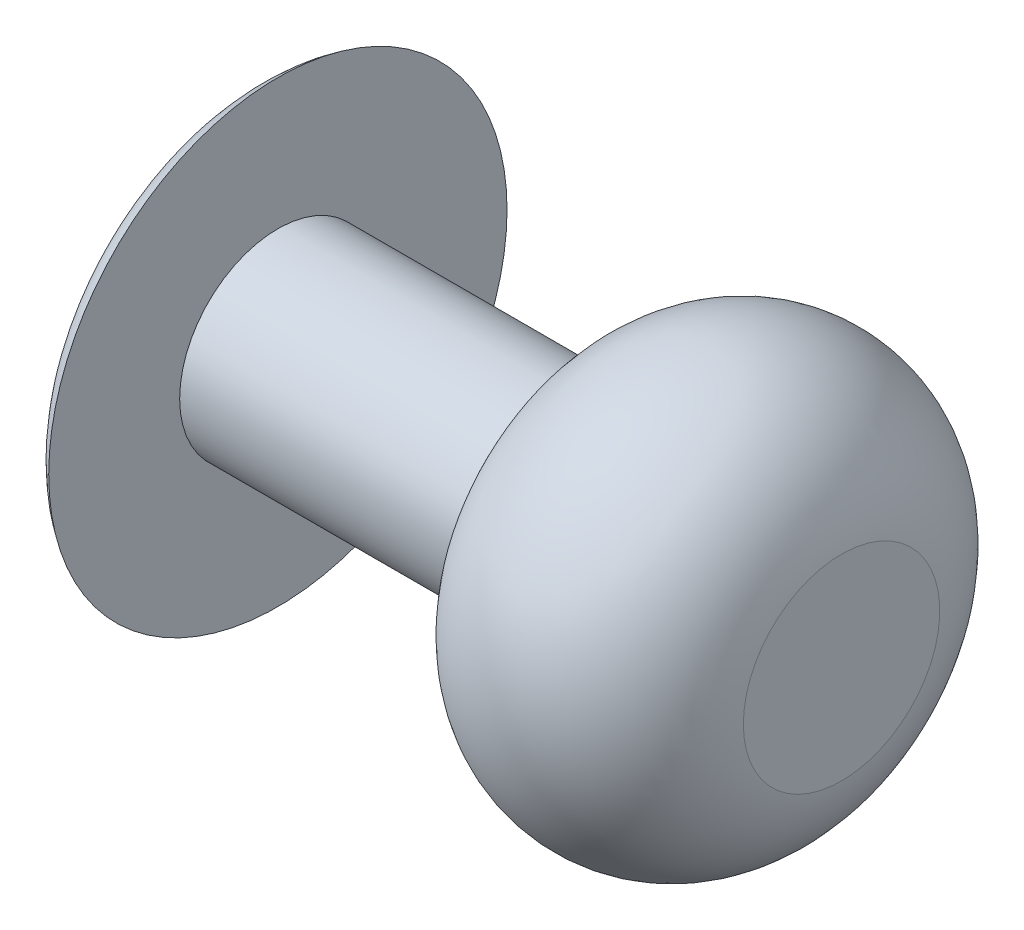
ISO-10303-21;
HEADER;
FILE_DESCRIPTION(('STEP AP214'),'2;1');
FILE_NAME('part.step','',(''),(''),'','','');
FILE_SCHEMA(('AUTOMOTIVE_DESIGN { 1 0 10303 214 1 1 1 1 }'));
ENDSEC;
DATA;
#1=APPLICATION_CONTEXT('core data for automotive mechanical design processes');
#2=APPLICATION_PROTOCOL_DEFINITION('international standard','automotive_design',2000,#1);
#3=PRODUCT_CONTEXT('',#1,'mechanical');
#4=PRODUCT('Part','Part','',(#3));
#5=PRODUCT_RELATED_PRODUCT_CATEGORY('part','',(#4));
#6=PRODUCT_DEFINITION_FORMATION('','',#4);
#7=PRODUCT_DEFINITION_CONTEXT('part definition',#1,'design');
#8=PRODUCT_DEFINITION('design','',#6,#7);
#9=PRODUCT_DEFINITION_SHAPE('','',#8);
#10=(LENGTH_UNIT() NAMED_UNIT(*) SI_UNIT(.MILLI.,.METRE.));
#11=(NAMED_UNIT(*) PLANE_ANGLE_UNIT() SI_UNIT($,.RADIAN.));
#12=(NAMED_UNIT(*) SI_UNIT($,.STERADIAN.) SOLID_ANGLE_UNIT());
#13=UNCERTAINTY_MEASURE_WITH_UNIT(LENGTH_MEASURE(1.E-05),#10,'distance_accuracy_value','');
#14=(GEOMETRIC_REPRESENTATION_CONTEXT(3) GLOBAL_UNCERTAINTY_ASSIGNED_CONTEXT((#13)) GLOBAL_UNIT_ASSIGNED_CONTEXT((#10,
#11,#12)) REPRESENTATION_CONTEXT('',''));
#15=CARTESIAN_POINT('',(0.,0.,0.));
#16=DIRECTION('',(0.,0.,1.));
#17=DIRECTION('',(1.,0.,0.));
#18=AXIS2_PLACEMENT_3D('',#15,#16,#17);
#19=CARTESIAN_POINT('',(-4.3300848277677,1.5,0.));
#20=DIRECTION('',(-1.,0.,0.));
#21=DIRECTION('',(0.,0.,1.));
#22=AXIS2_PLACEMENT_3D('',#19,#20,#21);
#23=PLANE('',#22);
#24=CARTESIAN_POINT('',(-4.3300848277677,0.,0.));
#25=DIRECTION('',(-1.,0.,0.));
#26=DIRECTION('',(0.,0.,1.));
#27=AXIS2_PLACEMENT_3D('',#24,#25,#26);
#28=CIRCLE('',#27,1.5);
#29=CARTESIAN_POINT('',(-4.3300848277677,0.,1.5));
#30=VERTEX_POINT('',#29);
#31=EDGE_CURVE('E10',#30,#30,#28,.T.);
#32=ORIENTED_EDGE('',*,*,#31,.F.);
#33=EDGE_LOOP('',(#32));
#34=FACE_BOUND('',#33,.T.);
#35=ADVANCED_FACE('F29',(#34),#23,.F.);
#36=CARTESIAN_POINT('',(-6.38449558112309,0.,0.));
#37=DIRECTION('',(-1.,0.,0.));
#38=DIRECTION('',(0.,0.,1.));
#39=AXIS2_PLACEMENT_3D('',#36,#37,#38);
#40=DEGENERATE_TOROIDAL_SURFACE('',#39,1.20496102807648,2.07548826507305,.T.);
#41=CARTESIAN_POINT('',(-8.43890633447847,0.,0.));
#42=DIRECTION('',(-1.,0.,0.));
#43=DIRECTION('',(0.,0.,1.));
#44=AXIS2_PLACEMENT_3D('',#41,#42,#43);
#45=CIRCLE('',#44,1.5);
#46=CARTESIAN_POINT('',(-8.43890633447847,0.,1.5));
#47=VERTEX_POINT('',#46);
#48=EDGE_CURVE('E35',#47,#47,#45,.T.);
#49=ORIENTED_EDGE('',*,*,#48,.F.);
#50=EDGE_LOOP('',(#49));
#51=FACE_BOUND('',#50,.T.);
#52=ORIENTED_EDGE('',*,*,#31,.T.);
#53=EDGE_LOOP('',(#52));
#54=FACE_BOUND('',#53,.T.);
#55=ADVANCED_FACE('F86',(#51,#54),#40,.T.);
#56=CARTESIAN_POINT('',(-91.1065657230587,0.,0.));
#57=DIRECTION('',(-1.,0.,0.));
#58=DIRECTION('',(0.,0.,1.));
#59=AXIS2_PLACEMENT_3D('',#56,#57,#58);
#60=CYLINDRICAL_SURFACE('',#59,1.5);
#61=CARTESIAN_POINT('',(-12.9389063344785,0.,0.));
#62=DIRECTION('',(-1.,0.,0.));
#63=DIRECTION('',(0.,0.,1.));
#64=AXIS2_PLACEMENT_3D('',#61,#62,#63);
#65=CIRCLE('',#64,1.5);
#66=CARTESIAN_POINT('',(-12.9389063344785,0.,1.5));
#67=VERTEX_POINT('',#66);
#68=EDGE_CURVE('E39',#67,#67,#65,.T.);
#69=ORIENTED_EDGE('',*,*,#68,.F.);
#70=EDGE_LOOP('',(#69));
#71=FACE_BOUND('',#70,.T.);
#72=ORIENTED_EDGE('',*,*,#48,.T.);
#73=EDGE_LOOP('',(#72));
#74=FACE_BOUND('',#73,.T.);
#75=ADVANCED_FACE('F81',(#71,#74),#60,.T.);
#76=CARTESIAN_POINT('',(-12.9389063344785,1.5,0.));
#77=DIRECTION('',(-1.,0.,0.));
#78=DIRECTION('',(0.,0.,1.));
#79=AXIS2_PLACEMENT_3D('',#76,#77,#78);
#80=PLANE('',#79);
#81=CARTESIAN_POINT('',(-12.9389063344785,0.,0.));
#82=DIRECTION('',(-1.,0.,0.));
#83=DIRECTION('',(0.,0.,1.));
#84=AXIS2_PLACEMENT_3D('',#81,#82,#83);
#85=CIRCLE('',#84,3.5);
#86=CARTESIAN_POINT('',(-12.9389063344785,0.,3.5));
#87=VERTEX_POINT('',#86);
#88=EDGE_CURVE('E43',#87,#87,#85,.T.);
#89=ORIENTED_EDGE('',*,*,#88,.F.);
#90=EDGE_LOOP('',(#89));
#91=FACE_BOUND('',#90,.T.);
#92=ORIENTED_EDGE('',*,*,#68,.T.);
#93=EDGE_LOOP('',(#92));
#94=FACE_BOUND('',#93,.T.);
#95=ADVANCED_FACE('F75',(#91,#94),#80,.F.);
#96=CARTESIAN_POINT('',(-12.3084517344285,0.,0.));
#97=DIRECTION('',(-1.,0.,0.));
#98=DIRECTION('',(0.,0.,1.));
#99=AXIS2_PLACEMENT_3D('',#96,#97,#98);
#100=TOROIDAL_SURFACE('',#99,2.5,1.18214762306749);
#101=CARTESIAN_POINT('',(-13.490599357496,0.,0.));
#102=DIRECTION('',(-1.,0.,0.));
#103=DIRECTION('',(0.,0.,1.));
#104=AXIS2_PLACEMENT_3D('',#101,#102,#103);
#105=CIRCLE('',#104,2.5);
#106=CARTESIAN_POINT('',(-13.490599357496,0.,2.5));
#107=VERTEX_POINT('',#106);
#108=EDGE_CURVE('E48',#107,#107,#105,.T.);
#109=ORIENTED_EDGE('',*,*,#108,.F.);
#110=EDGE_LOOP('',(#109));
#111=FACE_BOUND('',#110,.T.);
#112=ORIENTED_EDGE('',*,*,#88,.T.);
#113=EDGE_LOOP('',(#112));
#114=FACE_BOUND('',#113,.T.);
#115=ADVANCED_FACE('F69',(#111,#114),#100,.T.);
#116=CARTESIAN_POINT('',(-13.490599357496,0.,0.));
#117=DIRECTION('',(1.,0.,0.));
#118=DIRECTION('',(0.,0.,-1.));
#119=AXIS2_PLACEMENT_3D('',#116,#117,#118);
#120=PLANE('',#119);
#121=CARTESIAN_POINT('',(-13.490599357496,0.,0.));
#122=DIRECTION('',(-1.,0.,0.));
#123=DIRECTION('',(0.,0.,1.));
#124=AXIS2_PLACEMENT_3D('',#121,#122,#123);
#125=CIRCLE('',#124,1.);
#126=CARTESIAN_POINT('',(-13.490599357496,0.,1.));
#127=VERTEX_POINT('',#126);
#128=EDGE_CURVE('E52',#127,#127,#125,.T.);
#129=ORIENTED_EDGE('',*,*,#128,.F.);
#130=EDGE_LOOP('',(#129));
#131=FACE_BOUND('',#130,.T.);
#132=ORIENTED_EDGE('',*,*,#108,.T.);
#133=EDGE_LOOP('',(#132));
#134=FACE_BOUND('',#133,.T.);
#135=ADVANCED_FACE('F63',(#131,#134),#120,.F.);
#136=CARTESIAN_POINT('',(-9.49059935749604,0.,0.));
#137=DIRECTION('',(-1.,0.,0.));
#138=DIRECTION('',(0.,0.,1.));
#139=AXIS2_PLACEMENT_3D('',#136,#137,#138);
#140=CYLINDRICAL_SURFACE('',#139,1.);
#141=CARTESIAN_POINT('',(-9.49059935749604,0.,0.));
#142=DIRECTION('',(-1.,0.,0.));
#143=DIRECTION('',(0.,0.,1.));
#144=AXIS2_PLACEMENT_3D('',#141,#142,#143);
#145=CIRCLE('',#144,1.);
#146=CARTESIAN_POINT('',(-9.49059935749604,0.,1.));
#147=VERTEX_POINT('',#146);
#148=EDGE_CURVE('E51',#147,#147,#145,.T.);
#149=ORIENTED_EDGE('',*,*,#148,.F.);
#150=EDGE_LOOP('',(#149));
#151=FACE_BOUND('',#150,.T.);
#152=ORIENTED_EDGE('',*,*,#128,.T.);
#153=EDGE_LOOP('',(#152));
#154=FACE_BOUND('',#153,.T.);
#155=ADVANCED_FACE('F60',(#151,#154),#140,.F.);
#156=CARTESIAN_POINT('',(-9.49059935749604,0.,0.));
#157=DIRECTION('',(-1.,0.,0.));
#158=DIRECTION('',(0.,0.,1.));
#159=AXIS2_PLACEMENT_3D('',#156,#157,#158);
#160=PLANE('',#159);
#161=ORIENTED_EDGE('',*,*,#148,.T.);
#162=EDGE_LOOP('',(#161));
#163=FACE_BOUND('',#162,.T.);
#164=ADVANCED_FACE('F58',(#163),#160,.T.);
#165=CLOSED_SHELL('',(#35,#55,#75,#95,#115,#135,#155,#164));
#166=MANIFOLD_SOLID_BREP('B2',#165);
#167=ADVANCED_BREP_SHAPE_REPRESENTATION('',(#18,#166),#14);
#168=SHAPE_DEFINITION_REPRESENTATION(#9,#167);
ENDSEC;
END-ISO-10303-21;
